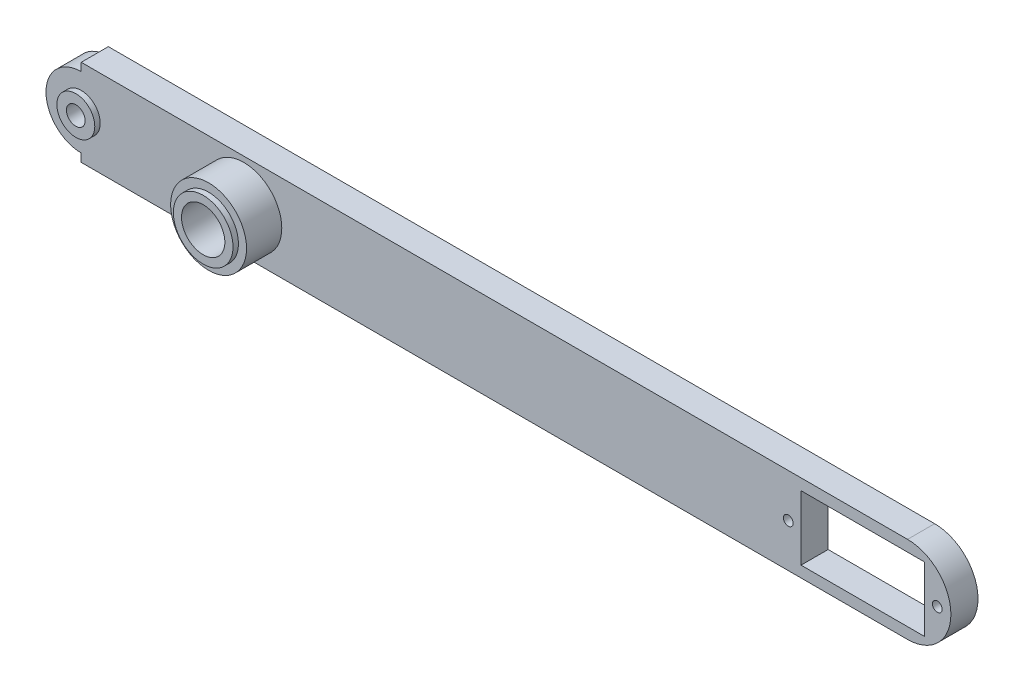
ISO-10303-21;
HEADER;
FILE_DESCRIPTION(('STEP AP214'),'2;1');
FILE_NAME('part.step','',(''),(''),'','','');
FILE_SCHEMA(('AUTOMOTIVE_DESIGN { 1 0 10303 214 1 1 1 1 }'));
ENDSEC;
DATA;
#1=APPLICATION_CONTEXT('core data for automotive mechanical design processes');
#2=APPLICATION_PROTOCOL_DEFINITION('international standard','automotive_design',2000,#1);
#3=PRODUCT_CONTEXT('',#1,'mechanical');
#4=PRODUCT('Part','Part','',(#3));
#5=PRODUCT_RELATED_PRODUCT_CATEGORY('part','',(#4));
#6=PRODUCT_DEFINITION_FORMATION('','',#4);
#7=PRODUCT_DEFINITION_CONTEXT('part definition',#1,'design');
#8=PRODUCT_DEFINITION('design','',#6,#7);
#9=PRODUCT_DEFINITION_SHAPE('','',#8);
#10=(LENGTH_UNIT() NAMED_UNIT(*) SI_UNIT(.MILLI.,.METRE.));
#11=(NAMED_UNIT(*) PLANE_ANGLE_UNIT() SI_UNIT($,.RADIAN.));
#12=(NAMED_UNIT(*) SI_UNIT($,.STERADIAN.) SOLID_ANGLE_UNIT());
#13=UNCERTAINTY_MEASURE_WITH_UNIT(LENGTH_MEASURE(1.E-05),#10,'distance_accuracy_value','');
#14=(GEOMETRIC_REPRESENTATION_CONTEXT(3) GLOBAL_UNCERTAINTY_ASSIGNED_CONTEXT((#13)) GLOBAL_UNIT_ASSIGNED_CONTEXT((#10,
#11,#12)) REPRESENTATION_CONTEXT('',''));
#15=CARTESIAN_POINT('',(0.,0.,0.));
#16=DIRECTION('',(0.,0.,1.));
#17=DIRECTION('',(1.,0.,0.));
#18=AXIS2_PLACEMENT_3D('',#15,#16,#17);
#19=CARTESIAN_POINT('',(-30.,8.,-4.));
#20=DIRECTION('',(1.,0.,0.));
#21=DIRECTION('',(0.,0.,-1.));
#22=AXIS2_PLACEMENT_3D('',#19,#20,#21);
#23=PLANE('',#22);
#24=DIRECTION('',(0.,0.,-1.));
#25=VECTOR('',#24,1.);
#26=CARTESIAN_POINT('',(-30.,-6.5,-4.));
#27=LINE('',#26,#25);
#28=CARTESIAN_POINT('',(-30.,-6.5,-9.));
#29=VERTEX_POINT('',#28);
#30=CARTESIAN_POINT('',(-30.,-6.5,-4.));
#31=VERTEX_POINT('',#30);
#32=EDGE_CURVE('E198',#29,#31,#27,.F.);
#33=ORIENTED_EDGE('',*,*,#32,.F.);
#34=DIRECTION('',(0.,-1.,0.));
#35=VECTOR('',#34,1.);
#36=CARTESIAN_POINT('',(-30.,8.,-9.));
#37=LINE('',#36,#35);
#38=CARTESIAN_POINT('',(-30.,-8.,-9.));
#39=VERTEX_POINT('',#38);
#40=EDGE_CURVE('E197',#29,#39,#37,.T.);
#41=ORIENTED_EDGE('',*,*,#40,.T.);
#42=DIRECTION('',(0.,0.,-1.));
#43=VECTOR('',#42,1.);
#44=CARTESIAN_POINT('',(-30.,-8.,-4.));
#45=LINE('',#44,#43);
#46=CARTESIAN_POINT('',(-30.,-8.,-4.));
#47=VERTEX_POINT('',#46);
#48=EDGE_CURVE('E50',#47,#39,#45,.T.);
#49=ORIENTED_EDGE('',*,*,#48,.F.);
#50=DIRECTION('',(0.,-1.,0.));
#51=VECTOR('',#50,1.);
#52=CARTESIAN_POINT('',(-30.,8.,-4.));
#53=LINE('',#52,#51);
#54=EDGE_CURVE('E203',#31,#47,#53,.T.);
#55=ORIENTED_EDGE('',*,*,#54,.F.);
#56=EDGE_LOOP('',(#33,#41,#49,#55));
#57=FACE_BOUND('',#56,.T.);
#58=ADVANCED_FACE('F39',(#57),#23,.F.);
#59=DIRECTION('',(0.,0.,-1.));
#60=VECTOR('',#59,1.);
#61=CARTESIAN_POINT('',(-30.,6.5,-4.));
#62=LINE('',#61,#60);
#63=CARTESIAN_POINT('',(-30.,6.5,-4.));
#64=VERTEX_POINT('',#63);
#65=CARTESIAN_POINT('',(-30.,6.5,-9.));
#66=VERTEX_POINT('',#65);
#67=EDGE_CURVE('E192',#64,#66,#62,.T.);
#68=ORIENTED_EDGE('',*,*,#67,.F.);
#69=CARTESIAN_POINT('',(-30.,8.,-4.));
#70=VERTEX_POINT('',#69);
#71=EDGE_CURVE('E199',#70,#64,#53,.T.);
#72=ORIENTED_EDGE('',*,*,#71,.F.);
#73=DIRECTION('',(0.,0.,-1.));
#74=VECTOR('',#73,1.);
#75=CARTESIAN_POINT('',(-30.,8.,-4.));
#76=LINE('',#75,#74);
#77=CARTESIAN_POINT('',(-30.,8.,-9.));
#78=VERTEX_POINT('',#77);
#79=EDGE_CURVE('E209',#70,#78,#76,.T.);
#80=ORIENTED_EDGE('',*,*,#79,.T.);
#81=EDGE_CURVE('E208',#78,#66,#37,.T.);
#82=ORIENTED_EDGE('',*,*,#81,.T.);
#83=EDGE_LOOP('',(#68,#72,#80,#82));
#84=FACE_BOUND('',#83,.T.);
#85=ADVANCED_FACE('F249',(#84),#23,.F.);
#86=CARTESIAN_POINT('',(-30.,-8.,-4.));
#87=DIRECTION('',(0.,1.,0.));
#88=DIRECTION('',(0.,0.,1.));
#89=AXIS2_PLACEMENT_3D('',#86,#87,#88);
#90=PLANE('',#89);
#91=DIRECTION('',(1.,0.,0.));
#92=VECTOR('',#91,1.);
#93=CARTESIAN_POINT('',(-30.,-8.,-9.));
#94=LINE('',#93,#92);
#95=CARTESIAN_POINT('',(122.45,-7.99999999999999,-9.));
#96=VERTEX_POINT('',#95);
#97=EDGE_CURVE('E214',#39,#96,#94,.T.);
#98=ORIENTED_EDGE('',*,*,#97,.T.);
#99=DIRECTION('',(0.,0.,-1.));
#100=VECTOR('',#99,1.);
#101=CARTESIAN_POINT('',(122.45,-8.,-4.));
#102=LINE('',#101,#100);
#103=CARTESIAN_POINT('',(122.45,-7.99999999999999,-4.));
#104=VERTEX_POINT('',#103);
#105=EDGE_CURVE('E222',#104,#96,#102,.T.);
#106=ORIENTED_EDGE('',*,*,#105,.F.);
#107=DIRECTION('',(1.,0.,0.));
#108=VECTOR('',#107,1.);
#109=CARTESIAN_POINT('',(-30.,-8.,-4.));
#110=LINE('',#109,#108);
#111=EDGE_CURVE('E204',#47,#104,#110,.T.);
#112=ORIENTED_EDGE('',*,*,#111,.F.);
#113=ORIENTED_EDGE('',*,*,#48,.T.);
#114=EDGE_LOOP('',(#98,#106,#112,#113));
#115=FACE_BOUND('',#114,.T.);
#116=ADVANCED_FACE('F227',(#115),#90,.F.);
#117=CARTESIAN_POINT('',(122.45,8.,-4.));
#118=DIRECTION('',(0.,-1.,0.));
#119=DIRECTION('',(0.,0.,-1.));
#120=AXIS2_PLACEMENT_3D('',#117,#118,#119);
#121=PLANE('',#120);
#122=DIRECTION('',(-1.,0.,0.));
#123=VECTOR('',#122,1.);
#124=CARTESIAN_POINT('',(122.45,8.,-9.));
#125=LINE('',#124,#123);
#126=CARTESIAN_POINT('',(122.45,8.,-9.));
#127=VERTEX_POINT('',#126);
#128=EDGE_CURVE('E213',#127,#78,#125,.T.);
#129=ORIENTED_EDGE('',*,*,#128,.T.);
#130=ORIENTED_EDGE('',*,*,#79,.F.);
#131=DIRECTION('',(-1.,0.,0.));
#132=VECTOR('',#131,1.);
#133=CARTESIAN_POINT('',(122.45,8.,-4.));
#134=LINE('',#133,#132);
#135=CARTESIAN_POINT('',(122.45,7.99999999999999,-4.));
#136=VERTEX_POINT('',#135);
#137=EDGE_CURVE('E210',#136,#70,#134,.T.);
#138=ORIENTED_EDGE('',*,*,#137,.F.);
#139=DIRECTION('',(0.,0.,-1.));
#140=VECTOR('',#139,1.);
#141=CARTESIAN_POINT('',(122.45,8.,-4.));
#142=LINE('',#141,#140);
#143=EDGE_CURVE('E217',#136,#127,#142,.T.);
#144=ORIENTED_EDGE('',*,*,#143,.T.);
#145=EDGE_LOOP('',(#129,#130,#138,#144));
#146=FACE_BOUND('',#145,.T.);
#147=ADVANCED_FACE('F241',(#146),#121,.F.);
#148=CARTESIAN_POINT('',(0.,0.,-4.));
#149=DIRECTION('',(0.,0.,1.));
#150=DIRECTION('',(1.,0.,0.));
#151=AXIS2_PLACEMENT_3D('',#148,#149,#150);
#152=PLANE('',#151);
#153=CARTESIAN_POINT('',(100.45,0.,-4.));
#154=DIRECTION('',(0.,0.,1.));
#155=DIRECTION('',(1.,0.,0.));
#156=AXIS2_PLACEMENT_3D('',#153,#154,#155);
#157=CIRCLE('',#156,0.899999999999998);
#158=CARTESIAN_POINT('',(101.35,0.,-4.));
#159=VERTEX_POINT('',#158);
#160=EDGE_CURVE('E136',#159,#159,#157,.T.);
#161=ORIENTED_EDGE('',*,*,#160,.F.);
#162=EDGE_LOOP('',(#161));
#163=FACE_BOUND('',#162,.T.);
#164=CARTESIAN_POINT('',(127.95,0.,-4.));
#165=DIRECTION('',(0.,0.,1.));
#166=DIRECTION('',(1.,0.,0.));
#167=AXIS2_PLACEMENT_3D('',#164,#165,#166);
#168=CIRCLE('',#167,0.900000000000012);
#169=CARTESIAN_POINT('',(128.85,0.,-4.));
#170=VERTEX_POINT('',#169);
#171=EDGE_CURVE('E138',#170,#170,#168,.T.);
#172=ORIENTED_EDGE('',*,*,#171,.F.);
#173=EDGE_LOOP('',(#172));
#174=FACE_BOUND('',#173,.T.);
#175=DIRECTION('',(0.,-1.,0.));
#176=VECTOR('',#175,1.);
#177=CARTESIAN_POINT('',(102.8,0.,-4.));
#178=LINE('',#177,#176);
#179=CARTESIAN_POINT('',(102.8,5.95,-4.));
#180=VERTEX_POINT('',#179);
#181=CARTESIAN_POINT('',(102.8,-5.95,-4.));
#182=VERTEX_POINT('',#181);
#183=EDGE_CURVE('E124',#180,#182,#178,.T.);
#184=ORIENTED_EDGE('',*,*,#183,.F.);
#185=DIRECTION('',(-1.,0.,0.));
#186=VECTOR('',#185,1.);
#187=CARTESIAN_POINT('',(0.,5.95,-4.));
#188=LINE('',#187,#186);
#189=CARTESIAN_POINT('',(125.6,5.95,-4.));
#190=VERTEX_POINT('',#189);
#191=EDGE_CURVE('E154',#190,#180,#188,.T.);
#192=ORIENTED_EDGE('',*,*,#191,.F.);
#193=DIRECTION('',(0.,1.,0.));
#194=VECTOR('',#193,1.);
#195=CARTESIAN_POINT('',(125.6,0.,-4.));
#196=LINE('',#195,#194);
#197=CARTESIAN_POINT('',(125.6,-5.95,-4.));
#198=VERTEX_POINT('',#197);
#199=EDGE_CURVE('E151',#198,#190,#196,.T.);
#200=ORIENTED_EDGE('',*,*,#199,.F.);
#201=DIRECTION('',(1.,0.,0.));
#202=VECTOR('',#201,1.);
#203=CARTESIAN_POINT('',(0.,-5.95,-4.));
#204=LINE('',#203,#202);
#205=EDGE_CURVE('E149',#182,#198,#204,.T.);
#206=ORIENTED_EDGE('',*,*,#205,.F.);
#207=EDGE_LOOP('',(#184,#192,#200,#206));
#208=FACE_BOUND('',#207,.T.);
#209=CARTESIAN_POINT('',(-30.,0.,-4.));
#210=DIRECTION('',(0.,0.,1.));
#211=DIRECTION('',(1.,0.,0.));
#212=AXIS2_PLACEMENT_3D('',#209,#210,#211);
#213=CIRCLE('',#212,3.5);
#214=CARTESIAN_POINT('',(-26.5,0.,-4.));
#215=VERTEX_POINT('',#214);
#216=EDGE_CURVE('E170',#215,#215,#213,.T.);
#217=ORIENTED_EDGE('',*,*,#216,.F.);
#218=EDGE_LOOP('',(#217));
#219=FACE_BOUND('',#218,.T.);
#220=CARTESIAN_POINT('',(0.,0.,-4.));
#221=DIRECTION('',(0.,0.,1.));
#222=DIRECTION('',(1.,0.,0.));
#223=AXIS2_PLACEMENT_3D('',#220,#221,#222);
#224=CIRCLE('',#223,7.);
#225=CARTESIAN_POINT('',(7.,0.,-4.));
#226=VERTEX_POINT('',#225);
#227=EDGE_CURVE('E177',#226,#226,#224,.F.);
#228=ORIENTED_EDGE('',*,*,#227,.T.);
#229=EDGE_LOOP('',(#228));
#230=FACE_BOUND('',#229,.T.);
#231=ORIENTED_EDGE('',*,*,#111,.T.);
#232=CARTESIAN_POINT('',(122.45,0.,-4.));
#233=DIRECTION('',(0.,0.,1.));
#234=DIRECTION('',(1.,0.,0.));
#235=AXIS2_PLACEMENT_3D('',#232,#233,#234);
#236=CIRCLE('',#235,7.99999999999999);
#237=EDGE_CURVE('E182',#104,#136,#236,.T.);
#238=ORIENTED_EDGE('',*,*,#237,.T.);
#239=ORIENTED_EDGE('',*,*,#137,.T.);
#240=ORIENTED_EDGE('',*,*,#71,.T.);
#241=CARTESIAN_POINT('',(-30.,0.,-4.));
#242=DIRECTION('',(0.,0.,1.));
#243=DIRECTION('',(1.,0.,0.));
#244=AXIS2_PLACEMENT_3D('',#241,#242,#243);
#245=CIRCLE('',#244,6.5);
#246=EDGE_CURVE('E189',#64,#31,#245,.T.);
#247=ORIENTED_EDGE('',*,*,#246,.T.);
#248=ORIENTED_EDGE('',*,*,#54,.T.);
#249=EDGE_LOOP('',(#231,#238,#239,#240,#247,#248));
#250=FACE_BOUND('',#249,.T.);
#251=ADVANCED_FACE('F244',(#163,#174,#208,#219,#230,#250),#152,.T.);
#252=CARTESIAN_POINT('',(0.,0.,-9.));
#253=DIRECTION('',(0.,0.,1.));
#254=DIRECTION('',(1.,0.,0.));
#255=AXIS2_PLACEMENT_3D('',#252,#253,#254);
#256=PLANE('',#255);
#257=CARTESIAN_POINT('',(40.,0.,-9.));
#258=DIRECTION('',(0.,0.,1.));
#259=DIRECTION('',(1.,0.,0.));
#260=AXIS2_PLACEMENT_3D('',#257,#258,#259);
#261=CIRCLE('',#260,2.);
#262=CARTESIAN_POINT('',(42.,0.,-9.));
#263=VERTEX_POINT('',#262);
#264=EDGE_CURVE('E530',#263,#263,#261,.T.);
#265=ORIENTED_EDGE('',*,*,#264,.T.);
#266=EDGE_LOOP('',(#265));
#267=FACE_BOUND('',#266,.T.);
#268=CARTESIAN_POINT('',(75.,0.,-9.));
#269=DIRECTION('',(0.,0.,1.));
#270=DIRECTION('',(1.,0.,0.));
#271=AXIS2_PLACEMENT_3D('',#268,#269,#270);
#272=CIRCLE('',#271,2.);
#273=CARTESIAN_POINT('',(77.,0.,-9.));
#274=VERTEX_POINT('',#273);
#275=EDGE_CURVE('E527',#274,#274,#272,.T.);
#276=ORIENTED_EDGE('',*,*,#275,.T.);
#277=EDGE_LOOP('',(#276));
#278=FACE_BOUND('',#277,.T.);
#279=CARTESIAN_POINT('',(100.45,0.,-9.));
#280=DIRECTION('',(0.,0.,1.));
#281=DIRECTION('',(1.,0.,0.));
#282=AXIS2_PLACEMENT_3D('',#279,#280,#281);
#283=CIRCLE('',#282,0.899999999999998);
#284=CARTESIAN_POINT('',(101.35,0.,-9.));
#285=VERTEX_POINT('',#284);
#286=EDGE_CURVE('E517',#285,#285,#283,.T.);
#287=ORIENTED_EDGE('',*,*,#286,.T.);
#288=EDGE_LOOP('',(#287));
#289=FACE_BOUND('',#288,.T.);
#290=CARTESIAN_POINT('',(127.95,0.,-9.));
#291=DIRECTION('',(0.,0.,1.));
#292=DIRECTION('',(1.,0.,0.));
#293=AXIS2_PLACEMENT_3D('',#290,#291,#292);
#294=CIRCLE('',#293,0.900000000000012);
#295=CARTESIAN_POINT('',(128.85,0.,-9.));
#296=VERTEX_POINT('',#295);
#297=EDGE_CURVE('E520',#296,#296,#294,.T.);
#298=ORIENTED_EDGE('',*,*,#297,.T.);
#299=EDGE_LOOP('',(#298));
#300=FACE_BOUND('',#299,.T.);
#301=DIRECTION('',(-1.,0.,0.));
#302=VECTOR('',#301,1.);
#303=CARTESIAN_POINT('',(125.6,5.95,-9.));
#304=LINE('',#303,#302);
#305=CARTESIAN_POINT('',(125.6,5.95,-9.));
#306=VERTEX_POINT('',#305);
#307=CARTESIAN_POINT('',(102.8,5.95,-9.));
#308=VERTEX_POINT('',#307);
#309=EDGE_CURVE('E127',#306,#308,#304,.T.);
#310=ORIENTED_EDGE('',*,*,#309,.T.);
#311=DIRECTION('',(0.,-1.,0.));
#312=VECTOR('',#311,1.);
#313=CARTESIAN_POINT('',(102.8,5.95,-9.));
#314=LINE('',#313,#312);
#315=CARTESIAN_POINT('',(102.8,-5.95,-9.));
#316=VERTEX_POINT('',#315);
#317=EDGE_CURVE('E119',#308,#316,#314,.T.);
#318=ORIENTED_EDGE('',*,*,#317,.T.);
#319=DIRECTION('',(1.,0.,0.));
#320=VECTOR('',#319,1.);
#321=CARTESIAN_POINT('',(102.8,-5.95,-9.));
#322=LINE('',#321,#320);
#323=CARTESIAN_POINT('',(125.6,-5.95,-9.));
#324=VERTEX_POINT('',#323);
#325=EDGE_CURVE('E126',#316,#324,#322,.T.);
#326=ORIENTED_EDGE('',*,*,#325,.T.);
#327=DIRECTION('',(0.,1.,0.));
#328=VECTOR('',#327,1.);
#329=CARTESIAN_POINT('',(125.6,-5.95,-9.));
#330=LINE('',#329,#328);
#331=EDGE_CURVE('E65',#324,#306,#330,.T.);
#332=ORIENTED_EDGE('',*,*,#331,.T.);
#333=EDGE_LOOP('',(#310,#318,#326,#332));
#334=FACE_BOUND('',#333,.T.);
#335=CARTESIAN_POINT('',(-30.,0.,-9.));
#336=DIRECTION('',(0.,0.,1.));
#337=DIRECTION('',(1.,0.,0.));
#338=AXIS2_PLACEMENT_3D('',#335,#336,#337);
#339=CIRCLE('',#338,1.725);
#340=CARTESIAN_POINT('',(-28.275,0.,-9.));
#341=VERTEX_POINT('',#340);
#342=EDGE_CURVE('E159',#341,#341,#339,.T.);
#343=ORIENTED_EDGE('',*,*,#342,.T.);
#344=EDGE_LOOP('',(#343));
#345=FACE_BOUND('',#344,.T.);
#346=CARTESIAN_POINT('',(0.,0.,-9.));
#347=DIRECTION('',(0.,0.,1.));
#348=DIRECTION('',(1.,0.,0.));
#349=AXIS2_PLACEMENT_3D('',#346,#347,#348);
#350=CIRCLE('',#349,4.);
#351=CARTESIAN_POINT('',(4.,0.,-9.));
#352=VERTEX_POINT('',#351);
#353=EDGE_CURVE('E165',#352,#352,#350,.T.);
#354=ORIENTED_EDGE('',*,*,#353,.T.);
#355=EDGE_LOOP('',(#354));
#356=FACE_BOUND('',#355,.T.);
#357=ORIENTED_EDGE('',*,*,#128,.F.);
#358=CARTESIAN_POINT('',(122.45,0.,-9.));
#359=DIRECTION('',(0.,0.,1.));
#360=DIRECTION('',(1.,0.,0.));
#361=AXIS2_PLACEMENT_3D('',#358,#359,#360);
#362=CIRCLE('',#361,7.99999999999999);
#363=EDGE_CURVE('E185',#96,#127,#362,.T.);
#364=ORIENTED_EDGE('',*,*,#363,.F.);
#365=ORIENTED_EDGE('',*,*,#97,.F.);
#366=ORIENTED_EDGE('',*,*,#40,.F.);
#367=CARTESIAN_POINT('',(-30.,0.,-9.));
#368=DIRECTION('',(0.,0.,1.));
#369=DIRECTION('',(1.,0.,0.));
#370=AXIS2_PLACEMENT_3D('',#367,#368,#369);
#371=CIRCLE('',#370,6.5);
#372=EDGE_CURVE('E187',#66,#29,#371,.T.);
#373=ORIENTED_EDGE('',*,*,#372,.F.);
#374=ORIENTED_EDGE('',*,*,#81,.F.);
#375=EDGE_LOOP('',(#357,#364,#365,#366,#373,#374));
#376=FACE_BOUND('',#375,.T.);
#377=ADVANCED_FACE('F131',(#267,#278,#289,#300,#334,#345,#356,#376),#256,.F.);
#378=CARTESIAN_POINT('',(-30.,0.,-4.));
#379=DIRECTION('',(0.,0.,-1.));
#380=DIRECTION('',(-1.,0.,0.));
#381=AXIS2_PLACEMENT_3D('',#378,#379,#380);
#382=CYLINDRICAL_SURFACE('',#381,6.5);
#383=ORIENTED_EDGE('',*,*,#372,.T.);
#384=ORIENTED_EDGE('',*,*,#32,.T.);
#385=ORIENTED_EDGE('',*,*,#246,.F.);
#386=ORIENTED_EDGE('',*,*,#67,.T.);
#387=EDGE_LOOP('',(#383,#384,#385,#386));
#388=FACE_BOUND('',#387,.T.);
#389=ADVANCED_FACE('F247',(#388),#382,.T.);
#390=CARTESIAN_POINT('',(122.45,0.,-4.));
#391=DIRECTION('',(0.,0.,-1.));
#392=DIRECTION('',(-1.,0.,0.));
#393=AXIS2_PLACEMENT_3D('',#390,#391,#392);
#394=CYLINDRICAL_SURFACE('',#393,7.99999999999999);
#395=ORIENTED_EDGE('',*,*,#237,.F.);
#396=ORIENTED_EDGE('',*,*,#105,.T.);
#397=ORIENTED_EDGE('',*,*,#363,.T.);
#398=ORIENTED_EDGE('',*,*,#143,.F.);
#399=EDGE_LOOP('',(#395,#396,#397,#398));
#400=FACE_BOUND('',#399,.T.);
#401=ADVANCED_FACE('F238',(#400),#394,.T.);
#402=CARTESIAN_POINT('',(0.,0.,2.5));
#403=DIRECTION('',(0.,0.,-1.));
#404=DIRECTION('',(-1.,0.,0.));
#405=AXIS2_PLACEMENT_3D('',#402,#403,#404);
#406=CYLINDRICAL_SURFACE('',#405,7.);
#407=ORIENTED_EDGE('',*,*,#227,.F.);
#408=EDGE_LOOP('',(#407));
#409=FACE_BOUND('',#408,.T.);
#410=CARTESIAN_POINT('',(0.,0.,2.5));
#411=DIRECTION('',(0.,0.,1.));
#412=DIRECTION('',(1.,0.,0.));
#413=AXIS2_PLACEMENT_3D('',#410,#411,#412);
#414=CIRCLE('',#413,7.);
#415=CARTESIAN_POINT('',(7.,0.,2.5));
#416=VERTEX_POINT('',#415);
#417=EDGE_CURVE('E174',#416,#416,#414,.T.);
#418=ORIENTED_EDGE('',*,*,#417,.F.);
#419=EDGE_LOOP('',(#418));
#420=FACE_BOUND('',#419,.T.);
#421=ADVANCED_FACE('F278',(#409,#420),#406,.T.);
#422=CARTESIAN_POINT('',(0.,0.,2.5));
#423=DIRECTION('',(0.,0.,1.));
#424=DIRECTION('',(1.,0.,0.));
#425=AXIS2_PLACEMENT_3D('',#422,#423,#424);
#426=PLANE('',#425);
#427=CARTESIAN_POINT('',(0.,0.,2.5));
#428=DIRECTION('',(0.,0.,1.));
#429=DIRECTION('',(1.,0.,0.));
#430=AXIS2_PLACEMENT_3D('',#427,#428,#429);
#431=CIRCLE('',#430,5.5);
#432=CARTESIAN_POINT('',(5.5,0.,2.5));
#433=VERTEX_POINT('',#432);
#434=EDGE_CURVE('E11',#433,#433,#431,.T.);
#435=ORIENTED_EDGE('',*,*,#434,.F.);
#436=EDGE_LOOP('',(#435));
#437=FACE_BOUND('',#436,.T.);
#438=ORIENTED_EDGE('',*,*,#417,.T.);
#439=EDGE_LOOP('',(#438));
#440=FACE_BOUND('',#439,.T.);
#441=ADVANCED_FACE('F288',(#437,#440),#426,.T.);
#442=CARTESIAN_POINT('',(0.,0.,3.5));
#443=DIRECTION('',(0.,0.,-1.));
#444=DIRECTION('',(-1.,0.,0.));
#445=AXIS2_PLACEMENT_3D('',#442,#443,#444);
#446=CYLINDRICAL_SURFACE('',#445,5.5);
#447=CARTESIAN_POINT('',(0.,0.,3.5));
#448=DIRECTION('',(0.,0.,1.));
#449=DIRECTION('',(1.,0.,0.));
#450=AXIS2_PLACEMENT_3D('',#447,#448,#449);
#451=CIRCLE('',#450,5.5);
#452=CARTESIAN_POINT('',(5.5,0.,3.5));
#453=VERTEX_POINT('',#452);
#454=EDGE_CURVE('E171',#453,#453,#451,.T.);
#455=ORIENTED_EDGE('',*,*,#454,.F.);
#456=EDGE_LOOP('',(#455));
#457=FACE_BOUND('',#456,.T.);
#458=ORIENTED_EDGE('',*,*,#434,.T.);
#459=EDGE_LOOP('',(#458));
#460=FACE_BOUND('',#459,.T.);
#461=ADVANCED_FACE('F296',(#457,#460),#446,.T.);
#462=CARTESIAN_POINT('',(0.,0.,3.5));
#463=DIRECTION('',(0.,0.,1.));
#464=DIRECTION('',(1.,0.,0.));
#465=AXIS2_PLACEMENT_3D('',#462,#463,#464);
#466=PLANE('',#465);
#467=CARTESIAN_POINT('',(0.,0.,3.5));
#468=DIRECTION('',(0.,0.,1.));
#469=DIRECTION('',(1.,0.,0.));
#470=AXIS2_PLACEMENT_3D('',#467,#468,#469);
#471=CIRCLE('',#470,4.);
#472=CARTESIAN_POINT('',(4.,0.,3.5));
#473=VERTEX_POINT('',#472);
#474=EDGE_CURVE('E163',#473,#473,#471,.T.);
#475=ORIENTED_EDGE('',*,*,#474,.F.);
#476=EDGE_LOOP('',(#475));
#477=FACE_BOUND('',#476,.T.);
#478=ORIENTED_EDGE('',*,*,#454,.T.);
#479=EDGE_LOOP('',(#478));
#480=FACE_BOUND('',#479,.T.);
#481=ADVANCED_FACE('F310',(#477,#480),#466,.T.);
#482=CARTESIAN_POINT('',(-30.,0.,-3.));
#483=DIRECTION('',(0.,0.,-1.));
#484=DIRECTION('',(-1.,0.,0.));
#485=AXIS2_PLACEMENT_3D('',#482,#483,#484);
#486=CYLINDRICAL_SURFACE('',#485,3.5);
#487=CARTESIAN_POINT('',(-30.,0.,-3.));
#488=DIRECTION('',(0.,0.,1.));
#489=DIRECTION('',(1.,0.,0.));
#490=AXIS2_PLACEMENT_3D('',#487,#488,#489);
#491=CIRCLE('',#490,3.5);
#492=CARTESIAN_POINT('',(-26.5,0.,-3.));
#493=VERTEX_POINT('',#492);
#494=EDGE_CURVE('E166',#493,#493,#491,.T.);
#495=ORIENTED_EDGE('',*,*,#494,.F.);
#496=EDGE_LOOP('',(#495));
#497=FACE_BOUND('',#496,.T.);
#498=ORIENTED_EDGE('',*,*,#216,.T.);
#499=EDGE_LOOP('',(#498));
#500=FACE_BOUND('',#499,.T.);
#501=ADVANCED_FACE('F317',(#497,#500),#486,.T.);
#502=CARTESIAN_POINT('',(-30.,0.,-3.));
#503=DIRECTION('',(0.,0.,1.));
#504=DIRECTION('',(1.,0.,0.));
#505=AXIS2_PLACEMENT_3D('',#502,#503,#504);
#506=PLANE('',#505);
#507=CARTESIAN_POINT('',(-30.,0.,-3.));
#508=DIRECTION('',(0.,0.,1.));
#509=DIRECTION('',(1.,0.,0.));
#510=AXIS2_PLACEMENT_3D('',#507,#508,#509);
#511=CIRCLE('',#510,1.725);
#512=CARTESIAN_POINT('',(-28.275,0.,-3.));
#513=VERTEX_POINT('',#512);
#514=EDGE_CURVE('E45',#513,#513,#511,.T.);
#515=ORIENTED_EDGE('',*,*,#514,.F.);
#516=EDGE_LOOP('',(#515));
#517=FACE_BOUND('',#516,.T.);
#518=ORIENTED_EDGE('',*,*,#494,.T.);
#519=EDGE_LOOP('',(#518));
#520=FACE_BOUND('',#519,.T.);
#521=ADVANCED_FACE('F323',(#517,#520),#506,.T.);
#522=CARTESIAN_POINT('',(0.,0.,-9.));
#523=DIRECTION('',(0.,0.,1.));
#524=DIRECTION('',(1.,0.,0.));
#525=AXIS2_PLACEMENT_3D('',#522,#523,#524);
#526=CYLINDRICAL_SURFACE('',#525,4.);
#527=ORIENTED_EDGE('',*,*,#353,.F.);
#528=EDGE_LOOP('',(#527));
#529=FACE_BOUND('',#528,.T.);
#530=ORIENTED_EDGE('',*,*,#474,.T.);
#531=EDGE_LOOP('',(#530));
#532=FACE_BOUND('',#531,.T.);
#533=ADVANCED_FACE('F333',(#529,#532),#526,.F.);
#534=CARTESIAN_POINT('',(-30.,0.,-9.));
#535=DIRECTION('',(0.,0.,1.));
#536=DIRECTION('',(1.,0.,0.));
#537=AXIS2_PLACEMENT_3D('',#534,#535,#536);
#538=CYLINDRICAL_SURFACE('',#537,1.725);
#539=ORIENTED_EDGE('',*,*,#514,.T.);
#540=EDGE_LOOP('',(#539));
#541=FACE_BOUND('',#540,.T.);
#542=ORIENTED_EDGE('',*,*,#342,.F.);
#543=EDGE_LOOP('',(#542));
#544=FACE_BOUND('',#543,.T.);
#545=ADVANCED_FACE('F345',(#541,#544),#538,.F.);
#546=CARTESIAN_POINT('',(102.8,5.95,-9.));
#547=DIRECTION('',(-1.,0.,0.));
#548=DIRECTION('',(0.,0.,1.));
#549=AXIS2_PLACEMENT_3D('',#546,#547,#548);
#550=PLANE('',#549);
#551=ORIENTED_EDGE('',*,*,#183,.T.);
#552=DIRECTION('',(0.,0.,1.));
#553=VECTOR('',#552,1.);
#554=CARTESIAN_POINT('',(102.8,-5.95,-9.));
#555=LINE('',#554,#553);
#556=EDGE_CURVE('E54',#316,#182,#555,.T.);
#557=ORIENTED_EDGE('',*,*,#556,.F.);
#558=ORIENTED_EDGE('',*,*,#317,.F.);
#559=DIRECTION('',(0.,0.,1.));
#560=VECTOR('',#559,1.);
#561=CARTESIAN_POINT('',(102.8,5.95,-9.));
#562=LINE('',#561,#560);
#563=EDGE_CURVE('E143',#308,#180,#562,.T.);
#564=ORIENTED_EDGE('',*,*,#563,.T.);
#565=EDGE_LOOP('',(#551,#557,#558,#564));
#566=FACE_BOUND('',#565,.T.);
#567=ADVANCED_FACE('F120',(#566),#550,.F.);
#568=CARTESIAN_POINT('',(125.6,5.95,-9.));
#569=DIRECTION('',(0.,1.,0.));
#570=DIRECTION('',(0.,0.,1.));
#571=AXIS2_PLACEMENT_3D('',#568,#569,#570);
#572=PLANE('',#571);
#573=ORIENTED_EDGE('',*,*,#191,.T.);
#574=ORIENTED_EDGE('',*,*,#563,.F.);
#575=ORIENTED_EDGE('',*,*,#309,.F.);
#576=DIRECTION('',(0.,0.,1.));
#577=VECTOR('',#576,1.);
#578=CARTESIAN_POINT('',(125.6,5.95,-9.));
#579=LINE('',#578,#577);
#580=EDGE_CURVE('E150',#306,#190,#579,.T.);
#581=ORIENTED_EDGE('',*,*,#580,.T.);
#582=EDGE_LOOP('',(#573,#574,#575,#581));
#583=FACE_BOUND('',#582,.T.);
#584=ADVANCED_FACE('F359',(#583),#572,.F.);
#585=CARTESIAN_POINT('',(125.6,-5.95,-9.));
#586=DIRECTION('',(1.,0.,0.));
#587=DIRECTION('',(0.,0.,-1.));
#588=AXIS2_PLACEMENT_3D('',#585,#586,#587);
#589=PLANE('',#588);
#590=ORIENTED_EDGE('',*,*,#199,.T.);
#591=ORIENTED_EDGE('',*,*,#580,.F.);
#592=ORIENTED_EDGE('',*,*,#331,.F.);
#593=DIRECTION('',(0.,0.,1.));
#594=VECTOR('',#593,1.);
#595=CARTESIAN_POINT('',(125.6,-5.95,-9.));
#596=LINE('',#595,#594);
#597=EDGE_CURVE('E123',#324,#198,#596,.T.);
#598=ORIENTED_EDGE('',*,*,#597,.T.);
#599=EDGE_LOOP('',(#590,#591,#592,#598));
#600=FACE_BOUND('',#599,.T.);
#601=ADVANCED_FACE('F368',(#600),#589,.F.);
#602=CARTESIAN_POINT('',(102.8,-5.95,-9.));
#603=DIRECTION('',(0.,-1.,0.));
#604=DIRECTION('',(0.,0.,-1.));
#605=AXIS2_PLACEMENT_3D('',#602,#603,#604);
#606=PLANE('',#605);
#607=ORIENTED_EDGE('',*,*,#205,.T.);
#608=ORIENTED_EDGE('',*,*,#597,.F.);
#609=ORIENTED_EDGE('',*,*,#325,.F.);
#610=ORIENTED_EDGE('',*,*,#556,.T.);
#611=EDGE_LOOP('',(#607,#608,#609,#610));
#612=FACE_BOUND('',#611,.T.);
#613=ADVANCED_FACE('F128',(#612),#606,.F.);
#614=CARTESIAN_POINT('',(127.95,0.,-9.));
#615=DIRECTION('',(0.,0.,1.));
#616=DIRECTION('',(1.,0.,0.));
#617=AXIS2_PLACEMENT_3D('',#614,#615,#616);
#618=CYLINDRICAL_SURFACE('',#617,0.900000000000012);
#619=ORIENTED_EDGE('',*,*,#171,.T.);
#620=EDGE_LOOP('',(#619));
#621=FACE_BOUND('',#620,.T.);
#622=ORIENTED_EDGE('',*,*,#297,.F.);
#623=EDGE_LOOP('',(#622));
#624=FACE_BOUND('',#623,.T.);
#625=ADVANCED_FACE('F381',(#621,#624),#618,.F.);
#626=CARTESIAN_POINT('',(100.45,0.,-9.));
#627=DIRECTION('',(0.,0.,1.));
#628=DIRECTION('',(1.,0.,0.));
#629=AXIS2_PLACEMENT_3D('',#626,#627,#628);
#630=CYLINDRICAL_SURFACE('',#629,0.899999999999998);
#631=ORIENTED_EDGE('',*,*,#160,.T.);
#632=EDGE_LOOP('',(#631));
#633=FACE_BOUND('',#632,.T.);
#634=ORIENTED_EDGE('',*,*,#286,.F.);
#635=EDGE_LOOP('',(#634));
#636=FACE_BOUND('',#635,.T.);
#637=ADVANCED_FACE('F395',(#633,#636),#630,.F.);
#638=CARTESIAN_POINT('',(75.,0.,-5.));
#639=DIRECTION('',(0.,0.,-1.));
#640=DIRECTION('',(-1.,0.,0.));
#641=AXIS2_PLACEMENT_3D('',#638,#639,#640);
#642=CYLINDRICAL_SURFACE('',#641,2.);
#643=CARTESIAN_POINT('',(75.,0.,-5.));
#644=DIRECTION('',(0.,0.,1.));
#645=DIRECTION('',(1.,0.,0.));
#646=AXIS2_PLACEMENT_3D('',#643,#644,#645);
#647=CIRCLE('',#646,2.);
#648=CARTESIAN_POINT('',(77.,0.,-5.));
#649=VERTEX_POINT('',#648);
#650=EDGE_CURVE('E522',#649,#649,#647,.T.);
#651=ORIENTED_EDGE('',*,*,#650,.T.);
#652=EDGE_LOOP('',(#651));
#653=FACE_BOUND('',#652,.T.);
#654=ORIENTED_EDGE('',*,*,#275,.F.);
#655=EDGE_LOOP('',(#654));
#656=FACE_BOUND('',#655,.T.);
#657=ADVANCED_FACE('F402',(#653,#656),#642,.F.);
#658=CARTESIAN_POINT('',(75.,0.,-5.));
#659=DIRECTION('',(0.,0.,1.));
#660=DIRECTION('',(1.,0.,0.));
#661=AXIS2_PLACEMENT_3D('',#658,#659,#660);
#662=PLANE('',#661);
#663=ORIENTED_EDGE('',*,*,#650,.F.);
#664=EDGE_LOOP('',(#663));
#665=FACE_BOUND('',#664,.T.);
#666=ADVANCED_FACE('F408',(#665),#662,.F.);
#667=CARTESIAN_POINT('',(40.,0.,-5.));
#668=DIRECTION('',(0.,0.,-1.));
#669=DIRECTION('',(-1.,0.,0.));
#670=AXIS2_PLACEMENT_3D('',#667,#668,#669);
#671=CYLINDRICAL_SURFACE('',#670,2.);
#672=CARTESIAN_POINT('',(40.,0.,-5.));
#673=DIRECTION('',(0.,0.,1.));
#674=DIRECTION('',(1.,0.,0.));
#675=AXIS2_PLACEMENT_3D('',#672,#673,#674);
#676=CIRCLE('',#675,2.);
#677=CARTESIAN_POINT('',(42.,0.,-5.));
#678=VERTEX_POINT('',#677);
#679=EDGE_CURVE('E525',#678,#678,#676,.T.);
#680=ORIENTED_EDGE('',*,*,#679,.T.);
#681=EDGE_LOOP('',(#680));
#682=FACE_BOUND('',#681,.T.);
#683=ORIENTED_EDGE('',*,*,#264,.F.);
#684=EDGE_LOOP('',(#683));
#685=FACE_BOUND('',#684,.T.);
#686=ADVANCED_FACE('F418',(#682,#685),#671,.F.);
#687=CARTESIAN_POINT('',(40.,0.,-5.));
#688=DIRECTION('',(0.,0.,1.));
#689=DIRECTION('',(1.,0.,0.));
#690=AXIS2_PLACEMENT_3D('',#687,#688,#689);
#691=PLANE('',#690);
#692=ORIENTED_EDGE('',*,*,#679,.F.);
#693=EDGE_LOOP('',(#692));
#694=FACE_BOUND('',#693,.T.);
#695=ADVANCED_FACE('F426',(#694),#691,.F.);
#696=CLOSED_SHELL('',(#58,#85,#116,#147,#251,#377,#389,#401,#421,#441,#461,#481,#501,#521,#533,
#545,#567,#584,#601,#613,#625,#637,#657,#666,#686,#695));
#697=MANIFOLD_SOLID_BREP('B2',#696);
#698=ADVANCED_BREP_SHAPE_REPRESENTATION('',(#18,#697),#14);
#699=SHAPE_DEFINITION_REPRESENTATION(#9,#698);
ENDSEC;
END-ISO-10303-21;
